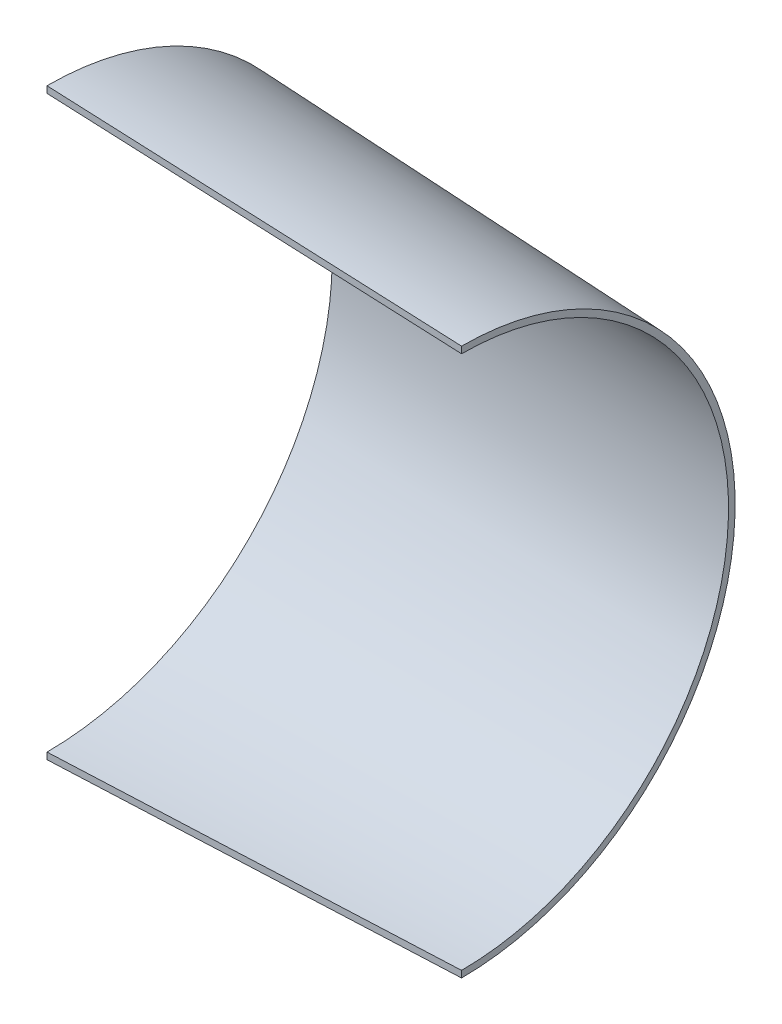
ISO-10303-21;
HEADER;
FILE_DESCRIPTION(('STEP AP214'),'2;1');
FILE_NAME('part.step','',(''),(''),'','','');
FILE_SCHEMA(('AUTOMOTIVE_DESIGN { 1 0 10303 214 1 1 1 1 }'));
ENDSEC;
DATA;
#1=APPLICATION_CONTEXT('core data for automotive mechanical design processes');
#2=APPLICATION_PROTOCOL_DEFINITION('international standard','automotive_design',2000,#1);
#3=PRODUCT_CONTEXT('',#1,'mechanical');
#4=PRODUCT('Part','Part','',(#3));
#5=PRODUCT_RELATED_PRODUCT_CATEGORY('part','',(#4));
#6=PRODUCT_DEFINITION_FORMATION('','',#4);
#7=PRODUCT_DEFINITION_CONTEXT('part definition',#1,'design');
#8=PRODUCT_DEFINITION('design','',#6,#7);
#9=PRODUCT_DEFINITION_SHAPE('','',#8);
#10=(LENGTH_UNIT() NAMED_UNIT(*) SI_UNIT(.MILLI.,.METRE.));
#11=(NAMED_UNIT(*) PLANE_ANGLE_UNIT() SI_UNIT($,.RADIAN.));
#12=(NAMED_UNIT(*) SI_UNIT($,.STERADIAN.) SOLID_ANGLE_UNIT());
#13=UNCERTAINTY_MEASURE_WITH_UNIT(LENGTH_MEASURE(1.E-05),#10,'distance_accuracy_value','');
#14=(GEOMETRIC_REPRESENTATION_CONTEXT(3) GLOBAL_UNCERTAINTY_ASSIGNED_CONTEXT((#13)) GLOBAL_UNIT_ASSIGNED_CONTEXT((#10,
#11,#12)) REPRESENTATION_CONTEXT('',''));
#15=CARTESIAN_POINT('',(0.,0.,0.));
#16=DIRECTION('',(0.,0.,1.));
#17=DIRECTION('',(1.,0.,0.));
#18=AXIS2_PLACEMENT_3D('',#15,#16,#17);
#19=CARTESIAN_POINT('',(3200.,0.,0.));
#20=DIRECTION('',(-1.,0.,0.));
#21=DIRECTION('',(0.,0.,1.));
#22=AXIS2_PLACEMENT_3D('',#19,#20,#21);
#23=CONICAL_SURFACE('',#22,1610.,0.0439716382710355);
#24=CARTESIAN_POINT('',(700.,0.,0.));
#25=DIRECTION('',(-1.,0.,0.));
#26=DIRECTION('',(0.,0.,1.));
#27=AXIS2_PLACEMENT_3D('',#24,#25,#26);
#28=CIRCLE('',#27,1720.);
#29=CARTESIAN_POINT('',(700.,1720.,-9.21744442524985E-05));
#30=VERTEX_POINT('',#29);
#31=CARTESIAN_POINT('',(700.,-1720.,0.));
#32=VERTEX_POINT('',#31);
#33=EDGE_CURVE('E11',#30,#32,#28,.T.);
#34=ORIENTED_EDGE('',*,*,#33,.T.);
#35=DIRECTION('',(-0.999033403272237,-0.0439574697439784,0.));
#36=VECTOR('',#35,1.);
#37=CARTESIAN_POINT('',(3200.,-1610.,0.));
#38=LINE('',#37,#36);
#39=CARTESIAN_POINT('',(3200.,-1610.,0.));
#40=VERTEX_POINT('',#39);
#41=EDGE_CURVE('E80',#40,#32,#38,.T.);
#42=ORIENTED_EDGE('',*,*,#41,.F.);
#43=CARTESIAN_POINT('',(3200.,0.,0.));
#44=DIRECTION('',(-1.,0.,0.));
#45=DIRECTION('',(0.,0.,1.));
#46=AXIS2_PLACEMENT_3D('',#43,#44,#45);
#47=CIRCLE('',#46,1610.);
#48=CARTESIAN_POINT('',(3200.,1610.,-8.62795670037922E-05));
#49=VERTEX_POINT('',#48);
#50=EDGE_CURVE('E53',#49,#40,#47,.T.);
#51=ORIENTED_EDGE('',*,*,#50,.F.);
#52=DIRECTION('',(-0.999033403272237,0.0439574697439783,-2.35567171185885E-09));
#53=VECTOR('',#52,1.);
#54=CARTESIAN_POINT('',(3200.,1610.,-8.62795670037922E-05));
#55=LINE('',#54,#53);
#56=EDGE_CURVE('E83',#49,#30,#55,.T.);
#57=ORIENTED_EDGE('',*,*,#56,.T.);
#58=EDGE_LOOP('',(#34,#42,#51,#57));
#59=FACE_BOUND('',#58,.T.);
#60=ADVANCED_FACE('F39',(#59),#23,.F.);
#61=CARTESIAN_POINT('',(700.,1720.,-9.21744442524985E-05));
#62=DIRECTION('',(-1.,0.,0.));
#63=DIRECTION('',(0.,0.,1.));
#64=AXIS2_PLACEMENT_3D('',#61,#62,#63);
#65=PLANE('',#64);
#66=CARTESIAN_POINT('',(700.,0.,0.));
#67=DIRECTION('',(-1.,0.,0.));
#68=DIRECTION('',(0.,0.,1.));
#69=AXIS2_PLACEMENT_3D('',#66,#67,#68);
#70=CIRCLE('',#69,1760.);
#71=CARTESIAN_POINT('',(700.,1760.,-9.43180359793007E-05));
#72=VERTEX_POINT('',#71);
#73=CARTESIAN_POINT('',(700.,-1760.,0.));
#74=VERTEX_POINT('',#73);
#75=EDGE_CURVE('E50',#72,#74,#70,.T.);
#76=ORIENTED_EDGE('',*,*,#75,.T.);
#77=DIRECTION('',(0.,-1.,0.));
#78=VECTOR('',#77,1.);
#79=CARTESIAN_POINT('',(700.,-1720.,0.));
#80=LINE('',#79,#78);
#81=EDGE_CURVE('E89',#32,#74,#80,.T.);
#82=ORIENTED_EDGE('',*,*,#81,.F.);
#83=ORIENTED_EDGE('',*,*,#33,.F.);
#84=DIRECTION('',(0.,0.999999999999999,-5.35897931700572E-08));
#85=VECTOR('',#84,1.);
#86=CARTESIAN_POINT('',(700.,1720.,-9.21744442524985E-05));
#87=LINE('',#86,#85);
#88=EDGE_CURVE('E99',#30,#72,#87,.T.);
#89=ORIENTED_EDGE('',*,*,#88,.T.);
#90=EDGE_LOOP('',(#76,#82,#83,#89));
#91=FACE_BOUND('',#90,.T.);
#92=ADVANCED_FACE('F41',(#91),#65,.T.);
#93=CARTESIAN_POINT('',(700.,0.,0.));
#94=DIRECTION('',(-1.,0.,0.));
#95=DIRECTION('',(0.,0.,1.));
#96=AXIS2_PLACEMENT_3D('',#93,#94,#95);
#97=CONICAL_SURFACE('',#96,1760.,0.0439716382710356);
#98=CARTESIAN_POINT('',(3200.,0.,0.));
#99=DIRECTION('',(-1.,0.,0.));
#100=DIRECTION('',(0.,0.,1.));
#101=AXIS2_PLACEMENT_3D('',#98,#99,#100);
#102=CIRCLE('',#101,1650.);
#103=CARTESIAN_POINT('',(3200.,1650.,-8.84231587305945E-05));
#104=VERTEX_POINT('',#103);
#105=CARTESIAN_POINT('',(3200.,-1650.,0.));
#106=VERTEX_POINT('',#105);
#107=EDGE_CURVE('E62',#104,#106,#102,.T.);
#108=ORIENTED_EDGE('',*,*,#107,.T.);
#109=DIRECTION('',(0.999033403272237,0.0439574697439784,0.));
#110=VECTOR('',#109,1.);
#111=CARTESIAN_POINT('',(700.,-1760.,0.));
#112=LINE('',#111,#110);
#113=EDGE_CURVE('E92',#74,#106,#112,.T.);
#114=ORIENTED_EDGE('',*,*,#113,.F.);
#115=ORIENTED_EDGE('',*,*,#75,.F.);
#116=DIRECTION('',(0.999033403272237,-0.0439574697439784,2.35567171185885E-09));
#117=VECTOR('',#116,1.);
#118=CARTESIAN_POINT('',(700.,1760.,-9.43180359793007E-05));
#119=LINE('',#118,#117);
#120=EDGE_CURVE('E105',#72,#104,#119,.T.);
#121=ORIENTED_EDGE('',*,*,#120,.T.);
#122=EDGE_LOOP('',(#108,#114,#115,#121));
#123=FACE_BOUND('',#122,.T.);
#124=ADVANCED_FACE('F109',(#123),#97,.T.);
#125=CARTESIAN_POINT('',(3200.,1650.,-8.84231587305945E-05));
#126=DIRECTION('',(1.,0.,0.));
#127=DIRECTION('',(0.,0.,-1.));
#128=AXIS2_PLACEMENT_3D('',#125,#126,#127);
#129=PLANE('',#128);
#130=DIRECTION('',(0.,-0.999999999999999,5.35897931700572E-08));
#131=VECTOR('',#130,1.);
#132=CARTESIAN_POINT('',(3200.,1650.,-8.84231587305945E-05));
#133=LINE('',#132,#131);
#134=EDGE_CURVE('E101',#104,#49,#133,.T.);
#135=ORIENTED_EDGE('',*,*,#134,.T.);
#136=ORIENTED_EDGE('',*,*,#50,.T.);
#137=DIRECTION('',(0.,1.,0.));
#138=VECTOR('',#137,1.);
#139=CARTESIAN_POINT('',(3200.,-1650.,0.));
#140=LINE('',#139,#138);
#141=EDGE_CURVE('E95',#106,#40,#140,.T.);
#142=ORIENTED_EDGE('',*,*,#141,.F.);
#143=ORIENTED_EDGE('',*,*,#107,.F.);
#144=EDGE_LOOP('',(#135,#136,#142,#143));
#145=FACE_BOUND('',#144,.T.);
#146=ADVANCED_FACE('F112',(#145),#129,.T.);
#147=CARTESIAN_POINT('',(0.,0.,0.));
#148=DIRECTION('',(0.,-5.35897931700572E-08,-0.999999999999999));
#149=DIRECTION('',(1.,0.,0.));
#150=AXIS2_PLACEMENT_3D('',#147,#148,#149);
#151=PLANE('',#150);
#152=ORIENTED_EDGE('',*,*,#56,.F.);
#153=ORIENTED_EDGE('',*,*,#134,.F.);
#154=ORIENTED_EDGE('',*,*,#120,.F.);
#155=ORIENTED_EDGE('',*,*,#88,.F.);
#156=EDGE_LOOP('',(#152,#153,#154,#155));
#157=FACE_BOUND('',#156,.T.);
#158=ADVANCED_FACE('F111',(#157),#151,.F.);
#159=CARTESIAN_POINT('',(0.,0.,0.));
#160=DIRECTION('',(0.,0.,1.));
#161=DIRECTION('',(1.,0.,0.));
#162=AXIS2_PLACEMENT_3D('',#159,#160,#161);
#163=PLANE('',#162);
#164=ORIENTED_EDGE('',*,*,#41,.T.);
#165=ORIENTED_EDGE('',*,*,#81,.T.);
#166=ORIENTED_EDGE('',*,*,#113,.T.);
#167=ORIENTED_EDGE('',*,*,#141,.T.);
#168=EDGE_LOOP('',(#164,#165,#166,#167));
#169=FACE_BOUND('',#168,.T.);
#170=ADVANCED_FACE('F88',(#169),#163,.T.);
#171=CLOSED_SHELL('',(#60,#92,#124,#146,#158,#170));
#172=MANIFOLD_SOLID_BREP('B2',#171);
#173=ADVANCED_BREP_SHAPE_REPRESENTATION('',(#18,#172),#14);
#174=SHAPE_DEFINITION_REPRESENTATION(#9,#173);
ENDSEC;
END-ISO-10303-21;
